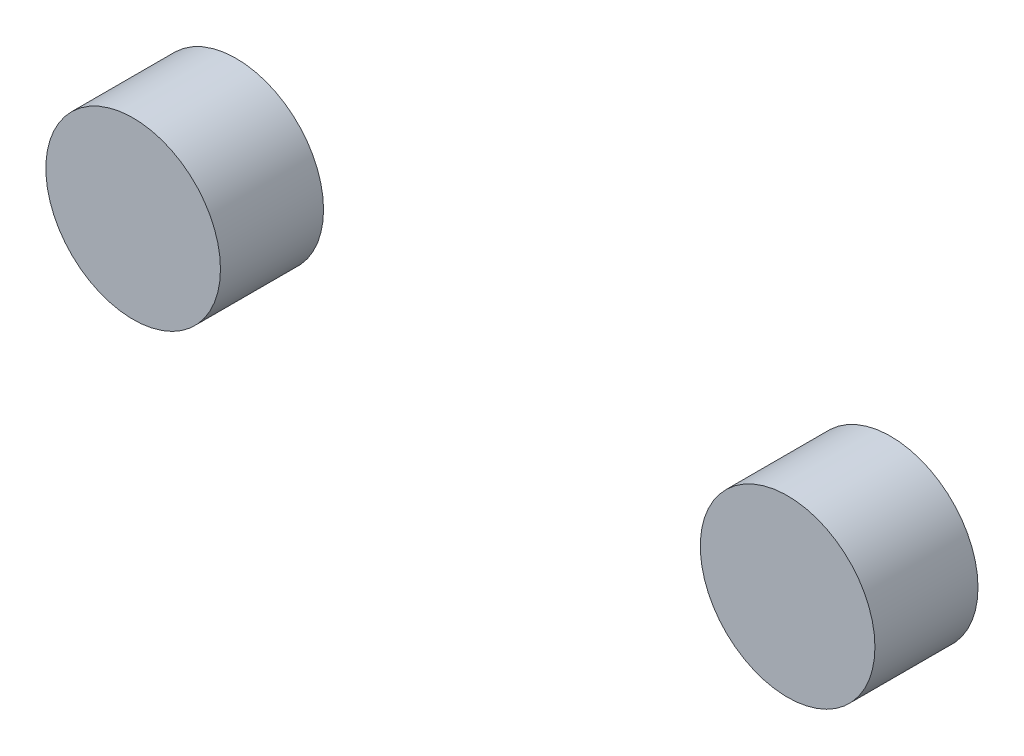
ISO-10303-21;
HEADER;
FILE_DESCRIPTION(('STEP AP214'),'2;1');
FILE_NAME('part.step','',(''),(''),'','','');
FILE_SCHEMA(('AUTOMOTIVE_DESIGN { 1 0 10303 214 1 1 1 1 }'));
ENDSEC;
DATA;
#1=APPLICATION_CONTEXT('core data for automotive mechanical design processes');
#2=APPLICATION_PROTOCOL_DEFINITION('international standard','automotive_design',2000,#1);
#3=PRODUCT_CONTEXT('',#1,'mechanical');
#4=PRODUCT('Part','Part','',(#3));
#5=PRODUCT_RELATED_PRODUCT_CATEGORY('part','',(#4));
#6=PRODUCT_DEFINITION_FORMATION('','',#4);
#7=PRODUCT_DEFINITION_CONTEXT('part definition',#1,'design');
#8=PRODUCT_DEFINITION('design','',#6,#7);
#9=PRODUCT_DEFINITION_SHAPE('','',#8);
#10=(LENGTH_UNIT() NAMED_UNIT(*) SI_UNIT(.MILLI.,.METRE.));
#11=(NAMED_UNIT(*) PLANE_ANGLE_UNIT() SI_UNIT($,.RADIAN.));
#12=(NAMED_UNIT(*) SI_UNIT($,.STERADIAN.) SOLID_ANGLE_UNIT());
#13=UNCERTAINTY_MEASURE_WITH_UNIT(LENGTH_MEASURE(1.E-05),#10,'distance_accuracy_value','');
#14=(GEOMETRIC_REPRESENTATION_CONTEXT(3) GLOBAL_UNCERTAINTY_ASSIGNED_CONTEXT((#13)) GLOBAL_UNIT_ASSIGNED_CONTEXT((#10,
#11,#12)) REPRESENTATION_CONTEXT('',''));
#15=CARTESIAN_POINT('',(0.,0.,0.));
#16=DIRECTION('',(0.,0.,1.));
#17=DIRECTION('',(1.,0.,0.));
#18=AXIS2_PLACEMENT_3D('',#15,#16,#17);
#19=CARTESIAN_POINT('',(0.,-6.35,0.1));
#20=DIRECTION('',(0.,0.,1.));
#21=DIRECTION('',(1.,0.,0.));
#22=AXIS2_PLACEMENT_3D('',#19,#20,#21);
#23=PLANE('',#22);
#24=CARTESIAN_POINT('',(0.,-6.35,0.1));
#25=DIRECTION('',(0.,0.,1.));
#26=DIRECTION('',(1.,0.,0.));
#27=AXIS2_PLACEMENT_3D('',#24,#25,#26);
#28=CIRCLE('',#27,1.525);
#29=CARTESIAN_POINT('',(1.525,-6.35,0.1));
#30=VERTEX_POINT('',#29);
#31=EDGE_CURVE('P0_E18',#30,#30,#28,.F.);
#32=ORIENTED_EDGE('',*,*,#31,.F.);
#33=EDGE_LOOP('',(#32));
#34=FACE_BOUND('',#33,.T.);
#35=ADVANCED_FACE('P0_F15',(#34),#23,.T.);
#36=CARTESIAN_POINT('',(0.,-6.35,-1.7));
#37=DIRECTION('',(0.,0.,1.));
#38=DIRECTION('',(1.,0.,0.));
#39=AXIS2_PLACEMENT_3D('',#36,#37,#38);
#40=PLANE('',#39);
#41=CARTESIAN_POINT('',(0.,-6.35,-1.7));
#42=DIRECTION('',(0.,0.,1.));
#43=DIRECTION('',(1.,0.,0.));
#44=AXIS2_PLACEMENT_3D('',#41,#42,#43);
#45=CIRCLE('',#44,1.525);
#46=CARTESIAN_POINT('',(1.525,-6.35,-1.7));
#47=VERTEX_POINT('',#46);
#48=EDGE_CURVE('P0_E10',#47,#47,#45,.T.);
#49=ORIENTED_EDGE('',*,*,#48,.F.);
#50=EDGE_LOOP('',(#49));
#51=FACE_BOUND('',#50,.T.);
#52=ADVANCED_FACE('P0_F30',(#51),#40,.F.);
#53=CARTESIAN_POINT('',(0.,-6.35,-1.7));
#54=DIRECTION('',(0.,0.,1.));
#55=DIRECTION('',(1.,0.,0.));
#56=AXIS2_PLACEMENT_3D('',#53,#54,#55);
#57=CYLINDRICAL_SURFACE('',#56,1.525);
#58=ORIENTED_EDGE('',*,*,#48,.T.);
#59=EDGE_LOOP('',(#58));
#60=FACE_BOUND('',#59,.T.);
#61=ORIENTED_EDGE('',*,*,#31,.T.);
#62=EDGE_LOOP('',(#61));
#63=FACE_BOUND('',#62,.T.);
#64=ADVANCED_FACE('P0_F27',(#60,#63),#57,.T.);
#65=CLOSED_SHELL('',(#35,#52,#64));
#66=MANIFOLD_SOLID_BREP('P0_B1',#65);
#67=CARTESIAN_POINT('',(-11.43,-6.35,0.1));
#68=DIRECTION('',(0.,0.,1.));
#69=DIRECTION('',(1.,0.,0.));
#70=AXIS2_PLACEMENT_3D('',#67,#68,#69);
#71=PLANE('',#70);
#72=CARTESIAN_POINT('',(-11.43,-6.35,0.1));
#73=DIRECTION('',(0.,0.,1.));
#74=DIRECTION('',(1.,0.,0.));
#75=AXIS2_PLACEMENT_3D('',#72,#73,#74);
#76=CIRCLE('',#75,1.525);
#77=CARTESIAN_POINT('',(-9.905,-6.35,0.1));
#78=VERTEX_POINT('',#77);
#79=EDGE_CURVE('P1_E18',#78,#78,#76,.F.);
#80=ORIENTED_EDGE('',*,*,#79,.F.);
#81=EDGE_LOOP('',(#80));
#82=FACE_BOUND('',#81,.T.);
#83=ADVANCED_FACE('P1_F15',(#82),#71,.T.);
#84=CARTESIAN_POINT('',(-11.43,-6.35,-1.7));
#85=DIRECTION('',(0.,0.,1.));
#86=DIRECTION('',(1.,0.,0.));
#87=AXIS2_PLACEMENT_3D('',#84,#85,#86);
#88=PLANE('',#87);
#89=CARTESIAN_POINT('',(-11.43,-6.35,-1.7));
#90=DIRECTION('',(0.,0.,1.));
#91=DIRECTION('',(1.,0.,0.));
#92=AXIS2_PLACEMENT_3D('',#89,#90,#91);
#93=CIRCLE('',#92,1.525);
#94=CARTESIAN_POINT('',(-9.905,-6.35,-1.7));
#95=VERTEX_POINT('',#94);
#96=EDGE_CURVE('P1_E10',#95,#95,#93,.T.);
#97=ORIENTED_EDGE('',*,*,#96,.F.);
#98=EDGE_LOOP('',(#97));
#99=FACE_BOUND('',#98,.T.);
#100=ADVANCED_FACE('P1_F30',(#99),#88,.F.);
#101=CARTESIAN_POINT('',(-11.43,-6.35,-1.7));
#102=DIRECTION('',(0.,0.,1.));
#103=DIRECTION('',(1.,0.,0.));
#104=AXIS2_PLACEMENT_3D('',#101,#102,#103);
#105=CYLINDRICAL_SURFACE('',#104,1.525);
#106=ORIENTED_EDGE('',*,*,#96,.T.);
#107=EDGE_LOOP('',(#106));
#108=FACE_BOUND('',#107,.T.);
#109=ORIENTED_EDGE('',*,*,#79,.T.);
#110=EDGE_LOOP('',(#109));
#111=FACE_BOUND('',#110,.T.);
#112=ADVANCED_FACE('P1_F27',(#108,#111),#105,.T.);
#113=CLOSED_SHELL('',(#83,#100,#112));
#114=MANIFOLD_SOLID_BREP('P1_B1',#113);
#115=ADVANCED_BREP_SHAPE_REPRESENTATION('',(#18,#66,#114),#14);
#116=SHAPE_DEFINITION_REPRESENTATION(#9,#115);
ENDSEC;
END-ISO-10303-21;
